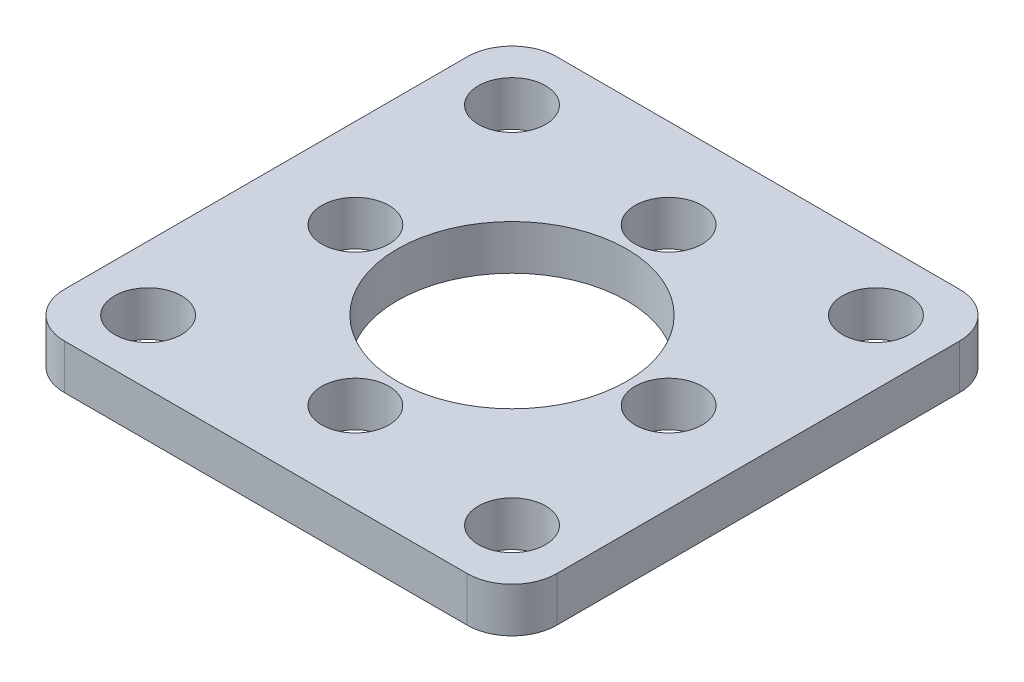
ISO-10303-21;
HEADER;
FILE_DESCRIPTION(('STEP AP214'),'2;1');
FILE_NAME('part.step','',(''),(''),'','','');
FILE_SCHEMA(('AUTOMOTIVE_DESIGN { 1 0 10303 214 1 1 1 1 }'));
ENDSEC;
DATA;
#1=APPLICATION_CONTEXT('core data for automotive mechanical design processes');
#2=APPLICATION_PROTOCOL_DEFINITION('international standard','automotive_design',2000,#1);
#3=PRODUCT_CONTEXT('',#1,'mechanical');
#4=PRODUCT('Part','Part','',(#3));
#5=PRODUCT_RELATED_PRODUCT_CATEGORY('part','',(#4));
#6=PRODUCT_DEFINITION_FORMATION('','',#4);
#7=PRODUCT_DEFINITION_CONTEXT('part definition',#1,'design');
#8=PRODUCT_DEFINITION('design','',#6,#7);
#9=PRODUCT_DEFINITION_SHAPE('','',#8);
#10=(LENGTH_UNIT() NAMED_UNIT(*) SI_UNIT(.MILLI.,.METRE.));
#11=(NAMED_UNIT(*) PLANE_ANGLE_UNIT() SI_UNIT($,.RADIAN.));
#12=(NAMED_UNIT(*) SI_UNIT($,.STERADIAN.) SOLID_ANGLE_UNIT());
#13=UNCERTAINTY_MEASURE_WITH_UNIT(LENGTH_MEASURE(1.E-05),#10,'distance_accuracy_value','');
#14=(GEOMETRIC_REPRESENTATION_CONTEXT(3) GLOBAL_UNCERTAINTY_ASSIGNED_CONTEXT((#13)) GLOBAL_UNIT_ASSIGNED_CONTEXT((#10,
#11,#12)) REPRESENTATION_CONTEXT('',''));
#15=CARTESIAN_POINT('',(0.,0.,0.));
#16=DIRECTION('',(0.,0.,1.));
#17=DIRECTION('',(1.,0.,0.));
#18=AXIS2_PLACEMENT_3D('',#15,#16,#17);
#19=CARTESIAN_POINT('',(0.,2.,0.));
#20=DIRECTION('',(0.,1.,0.));
#21=DIRECTION('',(0.,0.,1.));
#22=AXIS2_PLACEMENT_3D('',#19,#20,#21);
#23=PLANE('',#22);
#24=CARTESIAN_POINT('',(0.,2.,0.));
#25=DIRECTION('',(0.,1.,0.));
#26=DIRECTION('',(0.,0.,1.));
#27=AXIS2_PLACEMENT_3D('',#24,#25,#26);
#28=CIRCLE('',#27,5.125);
#29=CARTESIAN_POINT('',(0.,2.,5.125));
#30=VERTEX_POINT('',#29);
#31=EDGE_CURVE('E261',#30,#30,#28,.T.);
#32=ORIENTED_EDGE('',*,*,#31,.F.);
#33=EDGE_LOOP('',(#32));
#34=FACE_BOUND('',#33,.T.);
#35=CARTESIAN_POINT('',(-7.,2.,0.));
#36=DIRECTION('',(0.,1.,0.));
#37=DIRECTION('',(0.,0.,1.));
#38=AXIS2_PLACEMENT_3D('',#35,#36,#37);
#39=CIRCLE('',#38,1.5);
#40=CARTESIAN_POINT('',(-7.,2.,1.5));
#41=VERTEX_POINT('',#40);
#42=EDGE_CURVE('E236',#41,#41,#39,.F.);
#43=ORIENTED_EDGE('',*,*,#42,.T.);
#44=EDGE_LOOP('',(#43));
#45=FACE_BOUND('',#44,.T.);
#46=CARTESIAN_POINT('',(7.,2.,0.));
#47=DIRECTION('',(0.,1.,0.));
#48=DIRECTION('',(0.,0.,1.));
#49=AXIS2_PLACEMENT_3D('',#46,#47,#48);
#50=CIRCLE('',#49,1.5);
#51=CARTESIAN_POINT('',(7.,2.,1.5));
#52=VERTEX_POINT('',#51);
#53=EDGE_CURVE('E243',#52,#52,#50,.F.);
#54=ORIENTED_EDGE('',*,*,#53,.T.);
#55=EDGE_LOOP('',(#54));
#56=FACE_BOUND('',#55,.T.);
#57=CARTESIAN_POINT('',(0.,2.,-6.99999999999994));
#58=DIRECTION('',(0.,1.,0.));
#59=DIRECTION('',(0.,0.,1.));
#60=AXIS2_PLACEMENT_3D('',#57,#58,#59);
#61=CIRCLE('',#60,1.5);
#62=CARTESIAN_POINT('',(0.,2.,-5.49999999999994));
#63=VERTEX_POINT('',#62);
#64=EDGE_CURVE('E247',#63,#63,#61,.F.);
#65=ORIENTED_EDGE('',*,*,#64,.T.);
#66=EDGE_LOOP('',(#65));
#67=FACE_BOUND('',#66,.T.);
#68=CARTESIAN_POINT('',(0.,2.,7.00000000000006));
#69=DIRECTION('',(0.,1.,0.));
#70=DIRECTION('',(0.,0.,1.));
#71=AXIS2_PLACEMENT_3D('',#68,#69,#70);
#72=CIRCLE('',#71,1.5);
#73=CARTESIAN_POINT('',(0.,2.,8.50000000000006));
#74=VERTEX_POINT('',#73);
#75=EDGE_CURVE('E251',#74,#74,#72,.F.);
#76=ORIENTED_EDGE('',*,*,#75,.T.);
#77=EDGE_LOOP('',(#76));
#78=FACE_BOUND('',#77,.T.);
#79=CARTESIAN_POINT('',(8.13172798364534,2.,-8.13172798364525));
#80=DIRECTION('',(0.,1.,0.));
#81=DIRECTION('',(0.,0.,1.));
#82=AXIS2_PLACEMENT_3D('',#79,#80,#81);
#83=CIRCLE('',#82,1.5000000000008);
#84=CARTESIAN_POINT('',(8.13172798364534,2.,-6.63172798364445));
#85=VERTEX_POINT('',#84);
#86=EDGE_CURVE('E220',#85,#85,#83,.T.);
#87=ORIENTED_EDGE('',*,*,#86,.F.);
#88=EDGE_LOOP('',(#87));
#89=FACE_BOUND('',#88,.T.);
#90=CARTESIAN_POINT('',(-8.13172798364528,2.,-8.13172798364531));
#91=DIRECTION('',(0.,1.,0.));
#92=DIRECTION('',(0.,0.,1.));
#93=AXIS2_PLACEMENT_3D('',#90,#91,#92);
#94=CIRCLE('',#93,1.50000000000082);
#95=CARTESIAN_POINT('',(-8.13172798364528,2.,-6.63172798364449));
#96=VERTEX_POINT('',#95);
#97=EDGE_CURVE('E207',#96,#96,#94,.T.);
#98=ORIENTED_EDGE('',*,*,#97,.F.);
#99=EDGE_LOOP('',(#98));
#100=FACE_BOUND('',#99,.T.);
#101=DIRECTION('',(-1.,0.,0.));
#102=VECTOR('',#101,1.);
#103=CARTESIAN_POINT('',(-11.0012271874679,2.,-11.0012271874679));
#104=LINE('',#103,#102);
#105=CARTESIAN_POINT('',(9.00122718746789,2.,-11.0012271874679));
#106=VERTEX_POINT('',#105);
#107=CARTESIAN_POINT('',(-9.00122718746789,2.,-11.0012271874679));
#108=VERTEX_POINT('',#107);
#109=EDGE_CURVE('E194',#106,#108,#104,.T.);
#110=ORIENTED_EDGE('',*,*,#109,.T.);
#111=CARTESIAN_POINT('',(-9.00122718746789,2.,-9.00122718746795));
#112=DIRECTION('',(0.,1.,0.));
#113=DIRECTION('',(0.,0.,1.));
#114=AXIS2_PLACEMENT_3D('',#111,#112,#113);
#115=CIRCLE('',#114,2.);
#116=CARTESIAN_POINT('',(-11.0012271874679,2.,-9.00122718746795));
#117=VERTEX_POINT('',#116);
#118=EDGE_CURVE('E167',#108,#117,#115,.T.);
#119=ORIENTED_EDGE('',*,*,#118,.T.);
#120=DIRECTION('',(0.,0.,1.));
#121=VECTOR('',#120,1.);
#122=CARTESIAN_POINT('',(-11.0012271874679,2.,-11.0012271874679));
#123=LINE('',#122,#121);
#124=CARTESIAN_POINT('',(-11.0012271874679,2.,9.00122718746795));
#125=VERTEX_POINT('',#124);
#126=EDGE_CURVE('E124',#117,#125,#123,.T.);
#127=ORIENTED_EDGE('',*,*,#126,.T.);
#128=CARTESIAN_POINT('',(-9.00122718746789,2.,9.00122718746795));
#129=DIRECTION('',(0.,1.,0.));
#130=DIRECTION('',(0.,0.,1.));
#131=AXIS2_PLACEMENT_3D('',#128,#129,#130);
#132=CIRCLE('',#131,2.);
#133=CARTESIAN_POINT('',(-9.00122718746789,2.,11.0012271874679));
#134=VERTEX_POINT('',#133);
#135=EDGE_CURVE('E59',#125,#134,#132,.T.);
#136=ORIENTED_EDGE('',*,*,#135,.T.);
#137=DIRECTION('',(1.,0.,0.));
#138=VECTOR('',#137,1.);
#139=CARTESIAN_POINT('',(-11.0012271874679,2.,11.0012271874679));
#140=LINE('',#139,#138);
#141=CARTESIAN_POINT('',(9.00122718746789,2.,11.0012271874679));
#142=VERTEX_POINT('',#141);
#143=EDGE_CURVE('E145',#134,#142,#140,.T.);
#144=ORIENTED_EDGE('',*,*,#143,.T.);
#145=CARTESIAN_POINT('',(9.00122718746789,2.,9.00122718746795));
#146=DIRECTION('',(0.,1.,0.));
#147=DIRECTION('',(0.,0.,1.));
#148=AXIS2_PLACEMENT_3D('',#145,#146,#147);
#149=CIRCLE('',#148,2.);
#150=CARTESIAN_POINT('',(11.0012271874679,2.,9.00122718746795));
#151=VERTEX_POINT('',#150);
#152=EDGE_CURVE('E161',#142,#151,#149,.T.);
#153=ORIENTED_EDGE('',*,*,#152,.T.);
#154=DIRECTION('',(0.,0.,-1.));
#155=VECTOR('',#154,1.);
#156=CARTESIAN_POINT('',(11.0012271874679,2.,-11.0012271874679));
#157=LINE('',#156,#155);
#158=CARTESIAN_POINT('',(11.0012271874679,2.,-9.00122718746795));
#159=VERTEX_POINT('',#158);
#160=EDGE_CURVE('E138',#151,#159,#157,.T.);
#161=ORIENTED_EDGE('',*,*,#160,.T.);
#162=CARTESIAN_POINT('',(9.00122718746789,2.,-9.00122718746795));
#163=DIRECTION('',(0.,1.,0.));
#164=DIRECTION('',(0.,0.,1.));
#165=AXIS2_PLACEMENT_3D('',#162,#163,#164);
#166=CIRCLE('',#165,2.);
#167=EDGE_CURVE('E164',#159,#106,#166,.T.);
#168=ORIENTED_EDGE('',*,*,#167,.T.);
#169=EDGE_LOOP('',(#110,#119,#127,#136,#144,#153,#161,#168));
#170=FACE_BOUND('',#169,.T.);
#171=CARTESIAN_POINT('',(8.13172798364534,2.,8.13172798364525));
#172=DIRECTION('',(0.,1.,0.));
#173=DIRECTION('',(0.,0.,-1.));
#174=AXIS2_PLACEMENT_3D('',#171,#172,#173);
#175=CIRCLE('',#174,1.5000000000008);
#176=CARTESIAN_POINT('',(8.13172798364534,2.,6.63172798364445));
#177=VERTEX_POINT('',#176);
#178=EDGE_CURVE('E214',#177,#177,#175,.T.);
#179=ORIENTED_EDGE('',*,*,#178,.F.);
#180=EDGE_LOOP('',(#179));
#181=FACE_BOUND('',#180,.T.);
#182=CARTESIAN_POINT('',(-8.13172798364528,2.,8.13172798364531));
#183=DIRECTION('',(0.,1.,0.));
#184=DIRECTION('',(0.,0.,-1.));
#185=AXIS2_PLACEMENT_3D('',#182,#183,#184);
#186=CIRCLE('',#185,1.50000000000082);
#187=CARTESIAN_POINT('',(-8.13172798364528,2.,6.63172798364449));
#188=VERTEX_POINT('',#187);
#189=EDGE_CURVE('E228',#188,#188,#186,.T.);
#190=ORIENTED_EDGE('',*,*,#189,.F.);
#191=EDGE_LOOP('',(#190));
#192=FACE_BOUND('',#191,.T.);
#193=ADVANCED_FACE('F38',(#34,#45,#56,#67,#78,#89,#100,#170,#181,#192),#23,.T.);
#194=CARTESIAN_POINT('',(0.,0.,0.));
#195=DIRECTION('',(0.,1.,0.));
#196=DIRECTION('',(0.,0.,1.));
#197=AXIS2_PLACEMENT_3D('',#194,#195,#196);
#198=PLANE('',#197);
#199=CARTESIAN_POINT('',(0.,0.,0.));
#200=DIRECTION('',(0.,-1.,0.));
#201=DIRECTION('',(0.,0.,-1.));
#202=AXIS2_PLACEMENT_3D('',#199,#200,#201);
#203=CIRCLE('',#202,5.125);
#204=CARTESIAN_POINT('',(0.,0.,-5.125));
#205=VERTEX_POINT('',#204);
#206=EDGE_CURVE('E275',#205,#205,#203,.T.);
#207=ORIENTED_EDGE('',*,*,#206,.F.);
#208=EDGE_LOOP('',(#207));
#209=FACE_BOUND('',#208,.T.);
#210=CARTESIAN_POINT('',(-7.,0.,0.));
#211=DIRECTION('',(0.,1.,0.));
#212=DIRECTION('',(0.,0.,1.));
#213=AXIS2_PLACEMENT_3D('',#210,#211,#212);
#214=CIRCLE('',#213,1.5);
#215=CARTESIAN_POINT('',(-7.,0.,1.5));
#216=VERTEX_POINT('',#215);
#217=EDGE_CURVE('E255',#216,#216,#214,.T.);
#218=ORIENTED_EDGE('',*,*,#217,.T.);
#219=EDGE_LOOP('',(#218));
#220=FACE_BOUND('',#219,.T.);
#221=CARTESIAN_POINT('',(7.,0.,0.));
#222=DIRECTION('',(0.,1.,0.));
#223=DIRECTION('',(0.,0.,-1.));
#224=AXIS2_PLACEMENT_3D('',#221,#222,#223);
#225=CIRCLE('',#224,1.5);
#226=CARTESIAN_POINT('',(7.,0.,-1.5));
#227=VERTEX_POINT('',#226);
#228=EDGE_CURVE('E265',#227,#227,#225,.T.);
#229=ORIENTED_EDGE('',*,*,#228,.T.);
#230=EDGE_LOOP('',(#229));
#231=FACE_BOUND('',#230,.T.);
#232=CARTESIAN_POINT('',(0.,0.,-6.99999999999994));
#233=DIRECTION('',(0.,1.,0.));
#234=DIRECTION('',(0.,0.,1.));
#235=AXIS2_PLACEMENT_3D('',#232,#233,#234);
#236=CIRCLE('',#235,1.5);
#237=CARTESIAN_POINT('',(0.,0.,-5.49999999999994));
#238=VERTEX_POINT('',#237);
#239=EDGE_CURVE('E260',#238,#238,#236,.T.);
#240=ORIENTED_EDGE('',*,*,#239,.T.);
#241=EDGE_LOOP('',(#240));
#242=FACE_BOUND('',#241,.T.);
#243=CARTESIAN_POINT('',(0.,0.,7.00000000000006));
#244=DIRECTION('',(0.,1.,0.));
#245=DIRECTION('',(0.,0.,-1.));
#246=AXIS2_PLACEMENT_3D('',#243,#244,#245);
#247=CIRCLE('',#246,1.5);
#248=CARTESIAN_POINT('',(0.,0.,5.50000000000006));
#249=VERTEX_POINT('',#248);
#250=EDGE_CURVE('E256',#249,#249,#247,.T.);
#251=ORIENTED_EDGE('',*,*,#250,.T.);
#252=EDGE_LOOP('',(#251));
#253=FACE_BOUND('',#252,.T.);
#254=DIRECTION('',(0.,0.,1.));
#255=VECTOR('',#254,1.);
#256=CARTESIAN_POINT('',(-11.0012271874679,0.,-11.0012271874679));
#257=LINE('',#256,#255);
#258=CARTESIAN_POINT('',(-11.0012271874679,0.,-9.00122718746795));
#259=VERTEX_POINT('',#258);
#260=CARTESIAN_POINT('',(-11.0012271874679,0.,9.00122718746795));
#261=VERTEX_POINT('',#260);
#262=EDGE_CURVE('E122',#259,#261,#257,.T.);
#263=ORIENTED_EDGE('',*,*,#262,.F.);
#264=CARTESIAN_POINT('',(-9.00122718746789,0.,-9.00122718746795));
#265=DIRECTION('',(0.,1.,0.));
#266=DIRECTION('',(0.,0.,1.));
#267=AXIS2_PLACEMENT_3D('',#264,#265,#266);
#268=CIRCLE('',#267,2.);
#269=CARTESIAN_POINT('',(-9.00122718746789,0.,-11.0012271874679));
#270=VERTEX_POINT('',#269);
#271=EDGE_CURVE('E104',#259,#270,#268,.F.);
#272=ORIENTED_EDGE('',*,*,#271,.T.);
#273=DIRECTION('',(-1.,0.,0.));
#274=VECTOR('',#273,1.);
#275=CARTESIAN_POINT('',(-11.0012271874679,0.,-11.0012271874679));
#276=LINE('',#275,#274);
#277=CARTESIAN_POINT('',(9.00122718746789,0.,-11.0012271874679));
#278=VERTEX_POINT('',#277);
#279=EDGE_CURVE('E134',#278,#270,#276,.T.);
#280=ORIENTED_EDGE('',*,*,#279,.F.);
#281=CARTESIAN_POINT('',(9.00122718746789,0.,-9.00122718746795));
#282=DIRECTION('',(0.,1.,0.));
#283=DIRECTION('',(0.,0.,1.));
#284=AXIS2_PLACEMENT_3D('',#281,#282,#283);
#285=CIRCLE('',#284,2.);
#286=CARTESIAN_POINT('',(11.0012271874679,0.,-9.00122718746795));
#287=VERTEX_POINT('',#286);
#288=EDGE_CURVE('E116',#278,#287,#285,.F.);
#289=ORIENTED_EDGE('',*,*,#288,.T.);
#290=DIRECTION('',(0.,0.,-1.));
#291=VECTOR('',#290,1.);
#292=CARTESIAN_POINT('',(11.0012271874679,0.,-11.0012271874679));
#293=LINE('',#292,#291);
#294=CARTESIAN_POINT('',(11.0012271874679,0.,9.00122718746795));
#295=VERTEX_POINT('',#294);
#296=EDGE_CURVE('E140',#295,#287,#293,.T.);
#297=ORIENTED_EDGE('',*,*,#296,.F.);
#298=CARTESIAN_POINT('',(9.00122718746789,0.,9.00122718746795));
#299=DIRECTION('',(0.,1.,0.));
#300=DIRECTION('',(0.,0.,1.));
#301=AXIS2_PLACEMENT_3D('',#298,#299,#300);
#302=CIRCLE('',#301,2.);
#303=CARTESIAN_POINT('',(9.00122718746789,0.,11.0012271874679));
#304=VERTEX_POINT('',#303);
#305=EDGE_CURVE('E149',#295,#304,#302,.F.);
#306=ORIENTED_EDGE('',*,*,#305,.T.);
#307=DIRECTION('',(1.,0.,0.));
#308=VECTOR('',#307,1.);
#309=CARTESIAN_POINT('',(-11.0012271874679,0.,11.0012271874679));
#310=LINE('',#309,#308);
#311=CARTESIAN_POINT('',(-9.00122718746789,0.,11.0012271874679));
#312=VERTEX_POINT('',#311);
#313=EDGE_CURVE('E133',#312,#304,#310,.T.);
#314=ORIENTED_EDGE('',*,*,#313,.F.);
#315=CARTESIAN_POINT('',(-9.00122718746789,0.,9.00122718746795));
#316=DIRECTION('',(0.,1.,0.));
#317=DIRECTION('',(0.,0.,1.));
#318=AXIS2_PLACEMENT_3D('',#315,#316,#317);
#319=CIRCLE('',#318,2.);
#320=EDGE_CURVE('E126',#312,#261,#319,.F.);
#321=ORIENTED_EDGE('',*,*,#320,.T.);
#322=EDGE_LOOP('',(#263,#272,#280,#289,#297,#306,#314,#321));
#323=FACE_BOUND('',#322,.T.);
#324=CARTESIAN_POINT('',(-8.13172798364528,0.,-8.13172798364531));
#325=DIRECTION('',(0.,1.,0.));
#326=DIRECTION('',(0.,0.,1.));
#327=AXIS2_PLACEMENT_3D('',#324,#325,#326);
#328=CIRCLE('',#327,1.50000000000082);
#329=CARTESIAN_POINT('',(-8.13172798364528,0.,-6.63172798364449));
#330=VERTEX_POINT('',#329);
#331=EDGE_CURVE('E200',#330,#330,#328,.T.);
#332=ORIENTED_EDGE('',*,*,#331,.T.);
#333=EDGE_LOOP('',(#332));
#334=FACE_BOUND('',#333,.T.);
#335=CARTESIAN_POINT('',(8.13172798364534,0.,8.13172798364525));
#336=DIRECTION('',(0.,1.,0.));
#337=DIRECTION('',(0.,0.,-1.));
#338=AXIS2_PLACEMENT_3D('',#335,#336,#337);
#339=CIRCLE('',#338,1.5000000000008);
#340=CARTESIAN_POINT('',(8.13172798364534,0.,6.63172798364445));
#341=VERTEX_POINT('',#340);
#342=EDGE_CURVE('E216',#341,#341,#339,.T.);
#343=ORIENTED_EDGE('',*,*,#342,.T.);
#344=EDGE_LOOP('',(#343));
#345=FACE_BOUND('',#344,.T.);
#346=CARTESIAN_POINT('',(8.13172798364534,0.,-8.13172798364525));
#347=DIRECTION('',(0.,1.,0.));
#348=DIRECTION('',(0.,0.,1.));
#349=AXIS2_PLACEMENT_3D('',#346,#347,#348);
#350=CIRCLE('',#349,1.5000000000008);
#351=CARTESIAN_POINT('',(8.13172798364534,0.,-6.63172798364445));
#352=VERTEX_POINT('',#351);
#353=EDGE_CURVE('E224',#352,#352,#350,.T.);
#354=ORIENTED_EDGE('',*,*,#353,.T.);
#355=EDGE_LOOP('',(#354));
#356=FACE_BOUND('',#355,.T.);
#357=CARTESIAN_POINT('',(-8.13172798364528,0.,8.13172798364531));
#358=DIRECTION('',(0.,1.,0.));
#359=DIRECTION('',(0.,0.,-1.));
#360=AXIS2_PLACEMENT_3D('',#357,#358,#359);
#361=CIRCLE('',#360,1.50000000000082);
#362=CARTESIAN_POINT('',(-8.13172798364528,0.,6.63172798364449));
#363=VERTEX_POINT('',#362);
#364=EDGE_CURVE('E232',#363,#363,#361,.T.);
#365=ORIENTED_EDGE('',*,*,#364,.T.);
#366=EDGE_LOOP('',(#365));
#367=FACE_BOUND('',#366,.T.);
#368=ADVANCED_FACE('F129',(#209,#220,#231,#242,#253,#323,#334,#345,#356,#367),#198,.F.);
#369=CARTESIAN_POINT('',(11.0012271874679,2.,-11.0012271874679));
#370=DIRECTION('',(-1.,0.,0.));
#371=DIRECTION('',(0.,0.,1.));
#372=AXIS2_PLACEMENT_3D('',#369,#370,#371);
#373=PLANE('',#372);
#374=ORIENTED_EDGE('',*,*,#296,.T.);
#375=DIRECTION('',(0.,-1.,0.));
#376=VECTOR('',#375,1.);
#377=CARTESIAN_POINT('',(11.0012271874679,2.,-9.00122718746795));
#378=LINE('',#377,#376);
#379=EDGE_CURVE('E174',#287,#159,#378,.F.);
#380=ORIENTED_EDGE('',*,*,#379,.T.);
#381=ORIENTED_EDGE('',*,*,#160,.F.);
#382=DIRECTION('',(0.,-1.,0.));
#383=VECTOR('',#382,1.);
#384=CARTESIAN_POINT('',(11.0012271874679,2.,9.00122718746795));
#385=LINE('',#384,#383);
#386=EDGE_CURVE('E170',#151,#295,#385,.T.);
#387=ORIENTED_EDGE('',*,*,#386,.T.);
#388=EDGE_LOOP('',(#374,#380,#381,#387));
#389=FACE_BOUND('',#388,.T.);
#390=ADVANCED_FACE('F189',(#389),#373,.F.);
#391=CARTESIAN_POINT('',(-11.0012271874679,2.,-11.0012271874679));
#392=DIRECTION('',(0.,0.,1.));
#393=DIRECTION('',(1.,0.,0.));
#394=AXIS2_PLACEMENT_3D('',#391,#392,#393);
#395=PLANE('',#394);
#396=ORIENTED_EDGE('',*,*,#279,.T.);
#397=DIRECTION('',(0.,-1.,0.));
#398=VECTOR('',#397,1.);
#399=CARTESIAN_POINT('',(-9.00122718746789,2.,-11.0012271874679));
#400=LINE('',#399,#398);
#401=EDGE_CURVE('E109',#270,#108,#400,.F.);
#402=ORIENTED_EDGE('',*,*,#401,.T.);
#403=ORIENTED_EDGE('',*,*,#109,.F.);
#404=DIRECTION('',(0.,-1.,0.));
#405=VECTOR('',#404,1.);
#406=CARTESIAN_POINT('',(9.00122718746789,2.,-11.0012271874679));
#407=LINE('',#406,#405);
#408=EDGE_CURVE('E115',#106,#278,#407,.T.);
#409=ORIENTED_EDGE('',*,*,#408,.T.);
#410=EDGE_LOOP('',(#396,#402,#403,#409));
#411=FACE_BOUND('',#410,.T.);
#412=ADVANCED_FACE('F323',(#411),#395,.F.);
#413=CARTESIAN_POINT('',(-11.0012271874679,2.,-11.0012271874679));
#414=DIRECTION('',(1.,0.,0.));
#415=DIRECTION('',(0.,0.,-1.));
#416=AXIS2_PLACEMENT_3D('',#413,#414,#415);
#417=PLANE('',#416);
#418=ORIENTED_EDGE('',*,*,#126,.F.);
#419=DIRECTION('',(0.,-1.,0.));
#420=VECTOR('',#419,1.);
#421=CARTESIAN_POINT('',(-11.0012271874679,2.,-9.00122718746795));
#422=LINE('',#421,#420);
#423=EDGE_CURVE('E108',#117,#259,#422,.T.);
#424=ORIENTED_EDGE('',*,*,#423,.T.);
#425=ORIENTED_EDGE('',*,*,#262,.T.);
#426=DIRECTION('',(0.,-1.,0.));
#427=VECTOR('',#426,1.);
#428=CARTESIAN_POINT('',(-11.0012271874679,2.,9.00122718746795));
#429=LINE('',#428,#427);
#430=EDGE_CURVE('E127',#261,#125,#429,.F.);
#431=ORIENTED_EDGE('',*,*,#430,.T.);
#432=EDGE_LOOP('',(#418,#424,#425,#431));
#433=FACE_BOUND('',#432,.T.);
#434=ADVANCED_FACE('F121',(#433),#417,.F.);
#435=CARTESIAN_POINT('',(-11.0012271874679,2.,11.0012271874679));
#436=DIRECTION('',(0.,0.,-1.));
#437=DIRECTION('',(-1.,0.,0.));
#438=AXIS2_PLACEMENT_3D('',#435,#436,#437);
#439=PLANE('',#438);
#440=ORIENTED_EDGE('',*,*,#313,.T.);
#441=DIRECTION('',(0.,-1.,0.));
#442=VECTOR('',#441,1.);
#443=CARTESIAN_POINT('',(9.00122718746789,2.,11.0012271874679));
#444=LINE('',#443,#442);
#445=EDGE_CURVE('E11',#304,#142,#444,.F.);
#446=ORIENTED_EDGE('',*,*,#445,.T.);
#447=ORIENTED_EDGE('',*,*,#143,.F.);
#448=DIRECTION('',(0.,-1.,0.));
#449=VECTOR('',#448,1.);
#450=CARTESIAN_POINT('',(-9.00122718746789,2.,11.0012271874679));
#451=LINE('',#450,#449);
#452=EDGE_CURVE('E47',#134,#312,#451,.T.);
#453=ORIENTED_EDGE('',*,*,#452,.T.);
#454=EDGE_LOOP('',(#440,#446,#447,#453));
#455=FACE_BOUND('',#454,.T.);
#456=ADVANCED_FACE('F179',(#455),#439,.F.);
#457=CARTESIAN_POINT('',(-8.13172798364528,2.,-8.13172798364531));
#458=DIRECTION('',(0.,-1.,0.));
#459=DIRECTION('',(0.,0.,-1.));
#460=AXIS2_PLACEMENT_3D('',#457,#458,#459);
#461=CYLINDRICAL_SURFACE('',#460,1.50000000000082);
#462=ORIENTED_EDGE('',*,*,#97,.T.);
#463=EDGE_LOOP('',(#462));
#464=FACE_BOUND('',#463,.T.);
#465=ORIENTED_EDGE('',*,*,#331,.F.);
#466=EDGE_LOOP('',(#465));
#467=FACE_BOUND('',#466,.T.);
#468=ADVANCED_FACE('F316',(#464,#467),#461,.F.);
#469=CARTESIAN_POINT('',(8.13172798364534,2.,8.13172798364525));
#470=DIRECTION('',(0.,-1.,0.));
#471=DIRECTION('',(0.,0.,-1.));
#472=AXIS2_PLACEMENT_3D('',#469,#470,#471);
#473=CYLINDRICAL_SURFACE('',#472,1.5000000000008);
#474=ORIENTED_EDGE('',*,*,#178,.T.);
#475=EDGE_LOOP('',(#474));
#476=FACE_BOUND('',#475,.T.);
#477=ORIENTED_EDGE('',*,*,#342,.F.);
#478=EDGE_LOOP('',(#477));
#479=FACE_BOUND('',#478,.T.);
#480=ADVANCED_FACE('F415',(#476,#479),#473,.F.);
#481=CARTESIAN_POINT('',(8.13172798364534,2.,-8.13172798364525));
#482=DIRECTION('',(0.,-1.,0.));
#483=DIRECTION('',(0.,0.,-1.));
#484=AXIS2_PLACEMENT_3D('',#481,#482,#483);
#485=CYLINDRICAL_SURFACE('',#484,1.5000000000008);
#486=ORIENTED_EDGE('',*,*,#86,.T.);
#487=EDGE_LOOP('',(#486));
#488=FACE_BOUND('',#487,.T.);
#489=ORIENTED_EDGE('',*,*,#353,.F.);
#490=EDGE_LOOP('',(#489));
#491=FACE_BOUND('',#490,.T.);
#492=ADVANCED_FACE('F421',(#488,#491),#485,.F.);
#493=CARTESIAN_POINT('',(-8.13172798364528,2.,8.13172798364531));
#494=DIRECTION('',(0.,-1.,0.));
#495=DIRECTION('',(0.,0.,-1.));
#496=AXIS2_PLACEMENT_3D('',#493,#494,#495);
#497=CYLINDRICAL_SURFACE('',#496,1.50000000000082);
#498=ORIENTED_EDGE('',*,*,#189,.T.);
#499=EDGE_LOOP('',(#498));
#500=FACE_BOUND('',#499,.T.);
#501=ORIENTED_EDGE('',*,*,#364,.F.);
#502=EDGE_LOOP('',(#501));
#503=FACE_BOUND('',#502,.T.);
#504=ADVANCED_FACE('F332',(#500,#503),#497,.F.);
#505=CARTESIAN_POINT('',(-9.00122718746789,2.,-9.00122718746795));
#506=DIRECTION('',(0.,-1.,0.));
#507=DIRECTION('',(0.,0.,-1.));
#508=AXIS2_PLACEMENT_3D('',#505,#506,#507);
#509=CYLINDRICAL_SURFACE('',#508,2.);
#510=ORIENTED_EDGE('',*,*,#118,.F.);
#511=ORIENTED_EDGE('',*,*,#401,.F.);
#512=ORIENTED_EDGE('',*,*,#271,.F.);
#513=ORIENTED_EDGE('',*,*,#423,.F.);
#514=EDGE_LOOP('',(#510,#511,#512,#513));
#515=FACE_BOUND('',#514,.T.);
#516=ADVANCED_FACE('F107',(#515),#509,.T.);
#517=CARTESIAN_POINT('',(9.00122718746789,2.,-9.00122718746795));
#518=DIRECTION('',(0.,-1.,0.));
#519=DIRECTION('',(0.,0.,-1.));
#520=AXIS2_PLACEMENT_3D('',#517,#518,#519);
#521=CYLINDRICAL_SURFACE('',#520,2.);
#522=ORIENTED_EDGE('',*,*,#167,.F.);
#523=ORIENTED_EDGE('',*,*,#379,.F.);
#524=ORIENTED_EDGE('',*,*,#288,.F.);
#525=ORIENTED_EDGE('',*,*,#408,.F.);
#526=EDGE_LOOP('',(#522,#523,#524,#525));
#527=FACE_BOUND('',#526,.T.);
#528=ADVANCED_FACE('F331',(#527),#521,.T.);
#529=CARTESIAN_POINT('',(9.00122718746789,2.,9.00122718746795));
#530=DIRECTION('',(0.,-1.,0.));
#531=DIRECTION('',(0.,0.,-1.));
#532=AXIS2_PLACEMENT_3D('',#529,#530,#531);
#533=CYLINDRICAL_SURFACE('',#532,2.);
#534=ORIENTED_EDGE('',*,*,#152,.F.);
#535=ORIENTED_EDGE('',*,*,#445,.F.);
#536=ORIENTED_EDGE('',*,*,#305,.F.);
#537=ORIENTED_EDGE('',*,*,#386,.F.);
#538=EDGE_LOOP('',(#534,#535,#536,#537));
#539=FACE_BOUND('',#538,.T.);
#540=ADVANCED_FACE('F186',(#539),#533,.T.);
#541=CARTESIAN_POINT('',(-9.00122718746789,2.,9.00122718746795));
#542=DIRECTION('',(0.,-1.,0.));
#543=DIRECTION('',(0.,0.,-1.));
#544=AXIS2_PLACEMENT_3D('',#541,#542,#543);
#545=CYLINDRICAL_SURFACE('',#544,2.);
#546=ORIENTED_EDGE('',*,*,#135,.F.);
#547=ORIENTED_EDGE('',*,*,#430,.F.);
#548=ORIENTED_EDGE('',*,*,#320,.F.);
#549=ORIENTED_EDGE('',*,*,#452,.F.);
#550=EDGE_LOOP('',(#546,#547,#548,#549));
#551=FACE_BOUND('',#550,.T.);
#552=ADVANCED_FACE('F40',(#551),#545,.T.);
#553=CARTESIAN_POINT('',(0.,10.,7.00000000000006));
#554=DIRECTION('',(0.,-1.,0.));
#555=DIRECTION('',(0.,0.,-1.));
#556=AXIS2_PLACEMENT_3D('',#553,#554,#555);
#557=CYLINDRICAL_SURFACE('',#556,1.5);
#558=ORIENTED_EDGE('',*,*,#75,.F.);
#559=EDGE_LOOP('',(#558));
#560=FACE_BOUND('',#559,.T.);
#561=ORIENTED_EDGE('',*,*,#250,.F.);
#562=EDGE_LOOP('',(#561));
#563=FACE_BOUND('',#562,.T.);
#564=ADVANCED_FACE('F293',(#560,#563),#557,.F.);
#565=CARTESIAN_POINT('',(0.,10.,-6.99999999999994));
#566=DIRECTION('',(0.,-1.,0.));
#567=DIRECTION('',(0.,0.,-1.));
#568=AXIS2_PLACEMENT_3D('',#565,#566,#567);
#569=CYLINDRICAL_SURFACE('',#568,1.5);
#570=ORIENTED_EDGE('',*,*,#64,.F.);
#571=EDGE_LOOP('',(#570));
#572=FACE_BOUND('',#571,.T.);
#573=ORIENTED_EDGE('',*,*,#239,.F.);
#574=EDGE_LOOP('',(#573));
#575=FACE_BOUND('',#574,.T.);
#576=ADVANCED_FACE('F295',(#572,#575),#569,.F.);
#577=CARTESIAN_POINT('',(7.,10.,0.));
#578=DIRECTION('',(0.,-1.,0.));
#579=DIRECTION('',(0.,0.,-1.));
#580=AXIS2_PLACEMENT_3D('',#577,#578,#579);
#581=CYLINDRICAL_SURFACE('',#580,1.5);
#582=ORIENTED_EDGE('',*,*,#53,.F.);
#583=EDGE_LOOP('',(#582));
#584=FACE_BOUND('',#583,.T.);
#585=ORIENTED_EDGE('',*,*,#228,.F.);
#586=EDGE_LOOP('',(#585));
#587=FACE_BOUND('',#586,.T.);
#588=ADVANCED_FACE('F302',(#584,#587),#581,.F.);
#589=CARTESIAN_POINT('',(-7.,10.,0.));
#590=DIRECTION('',(0.,-1.,0.));
#591=DIRECTION('',(0.,0.,-1.));
#592=AXIS2_PLACEMENT_3D('',#589,#590,#591);
#593=CYLINDRICAL_SURFACE('',#592,1.5);
#594=ORIENTED_EDGE('',*,*,#42,.F.);
#595=EDGE_LOOP('',(#594));
#596=FACE_BOUND('',#595,.T.);
#597=ORIENTED_EDGE('',*,*,#217,.F.);
#598=EDGE_LOOP('',(#597));
#599=FACE_BOUND('',#598,.T.);
#600=ADVANCED_FACE('F362',(#596,#599),#593,.F.);
#601=CARTESIAN_POINT('',(0.,10.,0.));
#602=DIRECTION('',(0.,-1.,0.));
#603=DIRECTION('',(0.,0.,-1.));
#604=AXIS2_PLACEMENT_3D('',#601,#602,#603);
#605=CYLINDRICAL_SURFACE('',#604,5.125);
#606=ORIENTED_EDGE('',*,*,#31,.T.);
#607=EDGE_LOOP('',(#606));
#608=FACE_BOUND('',#607,.T.);
#609=ORIENTED_EDGE('',*,*,#206,.T.);
#610=EDGE_LOOP('',(#609));
#611=FACE_BOUND('',#610,.T.);
#612=ADVANCED_FACE('F280',(#608,#611),#605,.F.);
#613=CLOSED_SHELL('',(#193,#368,#390,#412,#434,#456,#468,#480,#492,#504,#516,#528,#540,#552,
#564,#576,#588,#600,#612));
#614=MANIFOLD_SOLID_BREP('B2',#613);
#615=ADVANCED_BREP_SHAPE_REPRESENTATION('',(#18,#614),#14);
#616=SHAPE_DEFINITION_REPRESENTATION(#9,#615);
ENDSEC;
END-ISO-10303-21;
